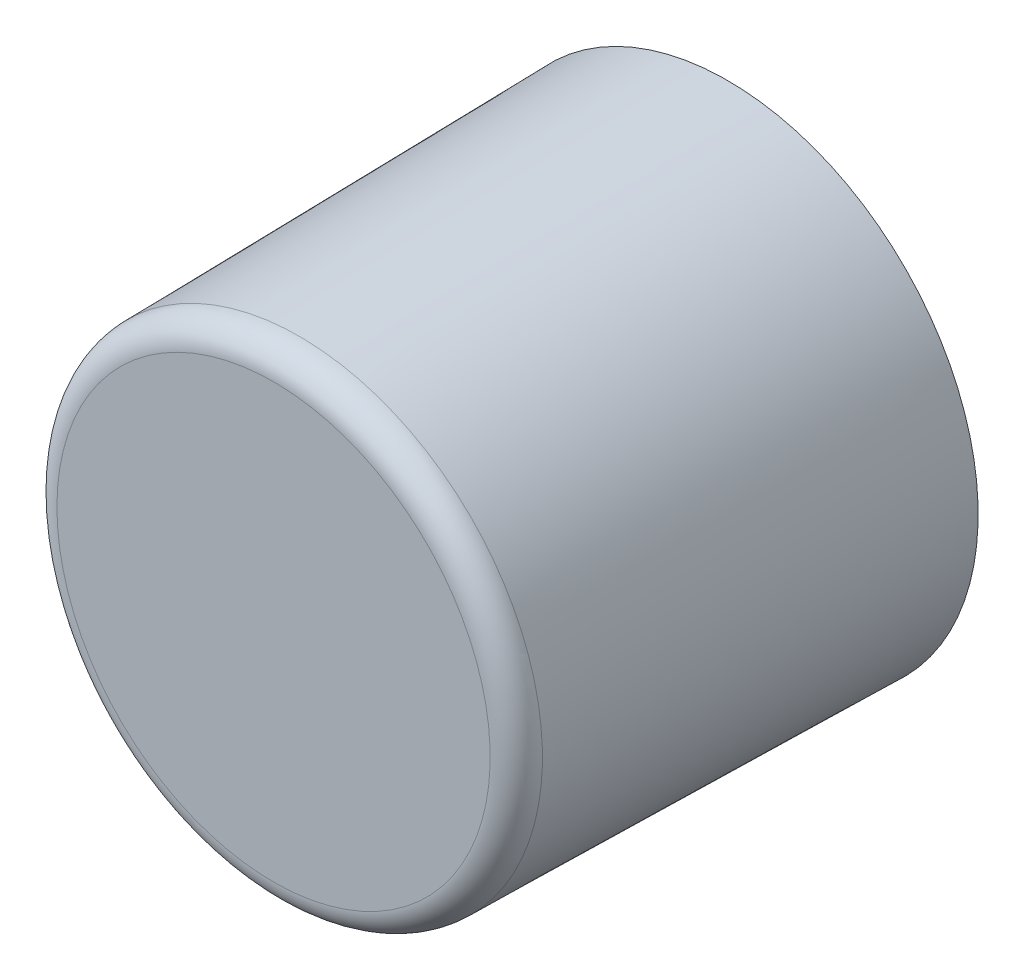
ISO-10303-21;
HEADER;
FILE_DESCRIPTION(('STEP AP214'),'2;1');
FILE_NAME('part.step','',(''),(''),'','','');
FILE_SCHEMA(('AUTOMOTIVE_DESIGN { 1 0 10303 214 1 1 1 1 }'));
ENDSEC;
DATA;
#1=APPLICATION_CONTEXT('core data for automotive mechanical design processes');
#2=APPLICATION_PROTOCOL_DEFINITION('international standard','automotive_design',2000,#1);
#3=PRODUCT_CONTEXT('',#1,'mechanical');
#4=PRODUCT('Part','Part','',(#3));
#5=PRODUCT_RELATED_PRODUCT_CATEGORY('part','',(#4));
#6=PRODUCT_DEFINITION_FORMATION('','',#4);
#7=PRODUCT_DEFINITION_CONTEXT('part definition',#1,'design');
#8=PRODUCT_DEFINITION('design','',#6,#7);
#9=PRODUCT_DEFINITION_SHAPE('','',#8);
#10=(LENGTH_UNIT() NAMED_UNIT(*) SI_UNIT(.MILLI.,.METRE.));
#11=(NAMED_UNIT(*) PLANE_ANGLE_UNIT() SI_UNIT($,.RADIAN.));
#12=(NAMED_UNIT(*) SI_UNIT($,.STERADIAN.) SOLID_ANGLE_UNIT());
#13=UNCERTAINTY_MEASURE_WITH_UNIT(LENGTH_MEASURE(1.E-05),#10,'distance_accuracy_value','');
#14=(GEOMETRIC_REPRESENTATION_CONTEXT(3) GLOBAL_UNCERTAINTY_ASSIGNED_CONTEXT((#13)) GLOBAL_UNIT_ASSIGNED_CONTEXT((#10,
#11,#12)) REPRESENTATION_CONTEXT('',''));
#15=CARTESIAN_POINT('',(0.,0.,0.));
#16=DIRECTION('',(0.,0.,1.));
#17=DIRECTION('',(1.,0.,0.));
#18=AXIS2_PLACEMENT_3D('',#15,#16,#17);
#19=CARTESIAN_POINT('',(0.,0.,-8.75));
#20=DIRECTION('',(0.,0.,1.));
#21=DIRECTION('',(1.,0.,0.));
#22=AXIS2_PLACEMENT_3D('',#19,#20,#21);
#23=PLANE('',#22);
#24=CARTESIAN_POINT('',(0.,0.,-8.75));
#25=DIRECTION('',(0.,0.,-1.));
#26=DIRECTION('',(-1.,0.,0.));
#27=AXIS2_PLACEMENT_3D('',#24,#25,#26);
#28=CIRCLE('',#27,4.826);
#29=CARTESIAN_POINT('',(-4.826,0.,-8.75));
#30=VERTEX_POINT('',#29);
#31=EDGE_CURVE('E80',#30,#30,#28,.T.);
#32=ORIENTED_EDGE('',*,*,#31,.T.);
#33=EDGE_LOOP('',(#32));
#34=FACE_BOUND('',#33,.T.);
#35=CARTESIAN_POINT('',(0.,0.,-8.75));
#36=DIRECTION('',(0.,0.,1.));
#37=DIRECTION('',(1.,0.,0.));
#38=AXIS2_PLACEMENT_3D('',#35,#36,#37);
#39=CIRCLE('',#38,3.125);
#40=CARTESIAN_POINT('',(3.125,0.,-8.75));
#41=VERTEX_POINT('',#40);
#42=EDGE_CURVE('E10',#41,#41,#39,.T.);
#43=ORIENTED_EDGE('',*,*,#42,.T.);
#44=EDGE_LOOP('',(#43));
#45=FACE_BOUND('',#44,.T.);
#46=ADVANCED_FACE('F15',(#34,#45),#23,.F.);
#47=CARTESIAN_POINT('',(0.,0.,-1.));
#48=DIRECTION('',(0.,0.,1.));
#49=DIRECTION('',(1.,0.,0.));
#50=AXIS2_PLACEMENT_3D('',#47,#48,#49);
#51=CYLINDRICAL_SURFACE('',#50,2.875);
#52=CARTESIAN_POINT('',(0.,0.,-8.5));
#53=DIRECTION('',(0.,0.,1.));
#54=DIRECTION('',(1.,0.,0.));
#55=AXIS2_PLACEMENT_3D('',#52,#53,#54);
#56=CIRCLE('',#55,2.875);
#57=CARTESIAN_POINT('',(2.875,0.,-8.5));
#58=VERTEX_POINT('',#57);
#59=EDGE_CURVE('E22',#58,#58,#56,.F.);
#60=ORIENTED_EDGE('',*,*,#59,.T.);
#61=EDGE_LOOP('',(#60));
#62=FACE_BOUND('',#61,.T.);
#63=CARTESIAN_POINT('',(0.,0.,-7.99855035159148));
#64=DIRECTION('',(0.,0.,1.));
#65=DIRECTION('',(1.,0.,0.));
#66=AXIS2_PLACEMENT_3D('',#63,#64,#65);
#67=CIRCLE('',#66,2.875);
#68=CARTESIAN_POINT('',(2.875,0.,-7.99855035159148));
#69=VERTEX_POINT('',#68);
#70=EDGE_CURVE('E59',#69,#69,#67,.T.);
#71=ORIENTED_EDGE('',*,*,#70,.T.);
#72=EDGE_LOOP('',(#71));
#73=FACE_BOUND('',#72,.T.);
#74=ADVANCED_FACE('F106',(#62,#73),#51,.F.);
#75=CARTESIAN_POINT('',(0.,0.,-5.73812986190585));
#76=DIRECTION('',(0.,0.,1.));
#77=DIRECTION('',(1.,0.,0.));
#78=AXIS2_PLACEMENT_3D('',#75,#76,#77);
#79=TOROIDAL_SURFACE('',#78,3.129,0.254);
#80=CARTESIAN_POINT('',(0.,0.,-5.73812986190585));
#81=DIRECTION('',(0.,0.,1.));
#82=DIRECTION('',(1.,0.,0.));
#83=AXIS2_PLACEMENT_3D('',#80,#81,#82);
#84=CIRCLE('',#83,2.875);
#85=CARTESIAN_POINT('',(2.875,0.,-5.73812986190585));
#86=VERTEX_POINT('',#85);
#87=EDGE_CURVE('E70',#86,#86,#84,.T.);
#88=ORIENTED_EDGE('',*,*,#87,.T.);
#89=EDGE_LOOP('',(#88));
#90=FACE_BOUND('',#89,.T.);
#91=CARTESIAN_POINT('',(0.,0.,-5.86512986190585));
#92=DIRECTION('',(0.,0.,1.));
#93=DIRECTION('',(1.,0.,0.));
#94=AXIS2_PLACEMENT_3D('',#91,#92,#93);
#95=CIRCLE('',#94,2.90902954743878);
#96=CARTESIAN_POINT('',(2.90902954743878,0.,-5.86512986190585));
#97=VERTEX_POINT('',#96);
#98=EDGE_CURVE('E30',#97,#97,#95,.T.);
#99=ORIENTED_EDGE('',*,*,#98,.F.);
#100=EDGE_LOOP('',(#99));
#101=FACE_BOUND('',#100,.T.);
#102=ADVANCED_FACE('F111',(#90,#101),#79,.T.);
#103=CARTESIAN_POINT('',(0.,0.,-6.10568021349746));
#104=DIRECTION('',(0.,0.,-1.));
#105=DIRECTION('',(-1.,0.,0.));
#106=AXIS2_PLACEMENT_3D('',#103,#104,#105);
#107=CONICAL_SURFACE('',#106,3.04791135768379,0.523598775598116);
#108=ORIENTED_EDGE('',*,*,#98,.T.);
#109=EDGE_LOOP('',(#108));
#110=FACE_BOUND('',#109,.T.);
#111=CARTESIAN_POINT('',(0.,0.,-6.10568021349746));
#112=DIRECTION('',(0.,0.,1.));
#113=DIRECTION('',(1.,0.,0.));
#114=AXIS2_PLACEMENT_3D('',#111,#112,#113);
#115=CIRCLE('',#114,3.04791135768379);
#116=CARTESIAN_POINT('',(3.04791135768379,0.,-6.10568021349746));
#117=VERTEX_POINT('',#116);
#118=EDGE_CURVE('E37',#117,#117,#115,.T.);
#119=ORIENTED_EDGE('',*,*,#118,.F.);
#120=EDGE_LOOP('',(#119));
#121=FACE_BOUND('',#120,.T.);
#122=ADVANCED_FACE('F117',(#110,#121),#107,.F.);
#123=CARTESIAN_POINT('',(0.,0.,-6.48668021349746));
#124=DIRECTION('',(0.,0.,1.));
#125=DIRECTION('',(1.,0.,0.));
#126=AXIS2_PLACEMENT_3D('',#123,#124,#125);
#127=TOROIDAL_SURFACE('',#126,2.38800000000005,0.762);
#128=ORIENTED_EDGE('',*,*,#118,.T.);
#129=EDGE_LOOP('',(#128));
#130=FACE_BOUND('',#129,.T.);
#131=CARTESIAN_POINT('',(0.,0.,-6.48668021349746));
#132=DIRECTION('',(0.,0.,1.));
#133=DIRECTION('',(1.,0.,0.));
#134=AXIS2_PLACEMENT_3D('',#131,#132,#133);
#135=CIRCLE('',#134,3.15000000000005);
#136=CARTESIAN_POINT('',(3.15000000000005,0.,-6.48668021349746));
#137=VERTEX_POINT('',#136);
#138=EDGE_CURVE('E43',#137,#137,#135,.T.);
#139=ORIENTED_EDGE('',*,*,#138,.F.);
#140=EDGE_LOOP('',(#139));
#141=FACE_BOUND('',#140,.T.);
#142=ADVANCED_FACE('F139',(#130,#141),#127,.F.);
#143=CARTESIAN_POINT('',(0.,0.,-1.));
#144=DIRECTION('',(0.,0.,1.));
#145=DIRECTION('',(1.,0.,0.));
#146=AXIS2_PLACEMENT_3D('',#143,#144,#145);
#147=CYLINDRICAL_SURFACE('',#146,3.15000000000007);
#148=ORIENTED_EDGE('',*,*,#138,.T.);
#149=EDGE_LOOP('',(#148));
#150=FACE_BOUND('',#149,.T.);
#151=CARTESIAN_POINT('',(0.,0.,-7.24999999999988));
#152=DIRECTION('',(0.,0.,1.));
#153=DIRECTION('',(1.,0.,0.));
#154=AXIS2_PLACEMENT_3D('',#151,#152,#153);
#155=CIRCLE('',#154,3.15000000000008);
#156=CARTESIAN_POINT('',(3.15000000000008,0.,-7.24999999999988));
#157=VERTEX_POINT('',#156);
#158=EDGE_CURVE('E47',#157,#157,#155,.T.);
#159=ORIENTED_EDGE('',*,*,#158,.F.);
#160=EDGE_LOOP('',(#159));
#161=FACE_BOUND('',#160,.T.);
#162=ADVANCED_FACE('F135',(#150,#161),#147,.F.);
#163=CARTESIAN_POINT('',(0.,0.,-7.24999999999988));
#164=DIRECTION('',(0.,0.,1.));
#165=DIRECTION('',(1.,0.,0.));
#166=AXIS2_PLACEMENT_3D('',#163,#164,#165);
#167=TOROIDAL_SURFACE('',#166,2.38800000000009,0.761999999999989);
#168=ORIENTED_EDGE('',*,*,#158,.T.);
#169=EDGE_LOOP('',(#168));
#170=FACE_BOUND('',#169,.T.);
#171=CARTESIAN_POINT('',(0.,0.,-7.63099999999988));
#172=DIRECTION('',(0.,0.,1.));
#173=DIRECTION('',(1.,0.,0.));
#174=AXIS2_PLACEMENT_3D('',#171,#172,#173);
#175=CIRCLE('',#174,3.04791135768382);
#176=CARTESIAN_POINT('',(3.04791135768382,0.,-7.63099999999988));
#177=VERTEX_POINT('',#176);
#178=EDGE_CURVE('E51',#177,#177,#175,.T.);
#179=ORIENTED_EDGE('',*,*,#178,.F.);
#180=EDGE_LOOP('',(#179));
#181=FACE_BOUND('',#180,.T.);
#182=ADVANCED_FACE('F131',(#170,#181),#167,.F.);
#183=CARTESIAN_POINT('',(0.,0.,-7.87155035159148));
#184=DIRECTION('',(0.,0.,1.));
#185=DIRECTION('',(1.,0.,0.));
#186=AXIS2_PLACEMENT_3D('',#183,#184,#185);
#187=CONICAL_SURFACE('',#186,2.90902954743876,0.52359877559829);
#188=ORIENTED_EDGE('',*,*,#178,.T.);
#189=EDGE_LOOP('',(#188));
#190=FACE_BOUND('',#189,.T.);
#191=CARTESIAN_POINT('',(0.,0.,-7.87155035159148));
#192=DIRECTION('',(0.,0.,1.));
#193=DIRECTION('',(1.,0.,0.));
#194=AXIS2_PLACEMENT_3D('',#191,#192,#193);
#195=CIRCLE('',#194,2.90902954743876);
#196=CARTESIAN_POINT('',(2.90902954743876,0.,-7.87155035159148));
#197=VERTEX_POINT('',#196);
#198=EDGE_CURVE('E55',#197,#197,#195,.T.);
#199=ORIENTED_EDGE('',*,*,#198,.F.);
#200=EDGE_LOOP('',(#199));
#201=FACE_BOUND('',#200,.T.);
#202=ADVANCED_FACE('F127',(#190,#201),#187,.F.);
#203=CARTESIAN_POINT('',(0.,0.,-7.99855035159155));
#204=DIRECTION('',(0.,0.,1.));
#205=DIRECTION('',(1.,0.,0.));
#206=AXIS2_PLACEMENT_3D('',#203,#204,#205);
#207=TOROIDAL_SURFACE('',#206,3.129,0.254000000000006);
#208=ORIENTED_EDGE('',*,*,#198,.T.);
#209=EDGE_LOOP('',(#208));
#210=FACE_BOUND('',#209,.T.);
#211=ORIENTED_EDGE('',*,*,#70,.F.);
#212=EDGE_LOOP('',(#211));
#213=FACE_BOUND('',#212,.T.);
#214=ADVANCED_FACE('F124',(#210,#213),#207,.T.);
#215=CARTESIAN_POINT('',(-2.375,0.,-1.));
#216=DIRECTION('',(0.,0.,-1.));
#217=DIRECTION('',(-1.,0.,0.));
#218=AXIS2_PLACEMENT_3D('',#215,#216,#217);
#219=PLANE('',#218);
#220=CARTESIAN_POINT('',(0.,0.,-1.));
#221=DIRECTION('',(0.,0.,1.));
#222=DIRECTION('',(1.,0.,0.));
#223=AXIS2_PLACEMENT_3D('',#220,#221,#222);
#224=CIRCLE('',#223,2.375);
#225=CARTESIAN_POINT('',(2.375,0.,-1.));
#226=VERTEX_POINT('',#225);
#227=EDGE_CURVE('E62',#226,#226,#224,.T.);
#228=ORIENTED_EDGE('',*,*,#227,.F.);
#229=EDGE_LOOP('',(#228));
#230=FACE_BOUND('',#229,.T.);
#231=ADVANCED_FACE('F122',(#230),#219,.T.);
#232=CARTESIAN_POINT('',(0.,0.,-1.5));
#233=DIRECTION('',(0.,0.,1.));
#234=DIRECTION('',(1.,0.,0.));
#235=AXIS2_PLACEMENT_3D('',#232,#233,#234);
#236=TOROIDAL_SURFACE('',#235,2.375,0.5);
#237=ORIENTED_EDGE('',*,*,#227,.T.);
#238=EDGE_LOOP('',(#237));
#239=FACE_BOUND('',#238,.T.);
#240=CARTESIAN_POINT('',(0.,0.,-1.5));
#241=DIRECTION('',(0.,0.,1.));
#242=DIRECTION('',(1.,0.,0.));
#243=AXIS2_PLACEMENT_3D('',#240,#241,#242);
#244=CIRCLE('',#243,2.875);
#245=CARTESIAN_POINT('',(2.875,0.,-1.5));
#246=VERTEX_POINT('',#245);
#247=EDGE_CURVE('E66',#246,#246,#244,.T.);
#248=ORIENTED_EDGE('',*,*,#247,.F.);
#249=EDGE_LOOP('',(#248));
#250=FACE_BOUND('',#249,.T.);
#251=ADVANCED_FACE('F201',(#239,#250),#236,.F.);
#252=CARTESIAN_POINT('',(0.,0.,-1.));
#253=DIRECTION('',(0.,0.,1.));
#254=DIRECTION('',(1.,0.,0.));
#255=AXIS2_PLACEMENT_3D('',#252,#253,#254);
#256=CYLINDRICAL_SURFACE('',#255,2.875);
#257=ORIENTED_EDGE('',*,*,#247,.T.);
#258=EDGE_LOOP('',(#257));
#259=FACE_BOUND('',#258,.T.);
#260=ORIENTED_EDGE('',*,*,#87,.F.);
#261=EDGE_LOOP('',(#260));
#262=FACE_BOUND('',#261,.T.);
#263=ADVANCED_FACE('F209',(#259,#262),#256,.F.);
#264=CARTESIAN_POINT('',(0.,0.,-8.5));
#265=DIRECTION('',(0.,0.,1.));
#266=DIRECTION('',(1.,0.,0.));
#267=AXIS2_PLACEMENT_3D('',#264,#265,#266);
#268=TOROIDAL_SURFACE('',#267,3.125,0.25);
#269=ORIENTED_EDGE('',*,*,#42,.F.);
#270=EDGE_LOOP('',(#269));
#271=FACE_BOUND('',#270,.T.);
#272=ORIENTED_EDGE('',*,*,#59,.F.);
#273=EDGE_LOOP('',(#272));
#274=FACE_BOUND('',#273,.T.);
#275=ADVANCED_FACE('F95',(#271,#274),#268,.T.);
#276=CARTESIAN_POINT('',(0.,0.,-0.508));
#277=DIRECTION('',(0.,0.,-1.));
#278=DIRECTION('',(-1.,0.,0.));
#279=AXIS2_PLACEMENT_3D('',#276,#277,#278);
#280=TOROIDAL_SURFACE('',#279,4.17405797221532,0.508);
#281=CARTESIAN_POINT('',(0.,0.,-0.499134177529864));
#282=DIRECTION('',(0.,0.,-1.));
#283=DIRECTION('',(-1.,0.,0.));
#284=AXIS2_PLACEMENT_3D('',#281,#282,#283);
#285=CIRCLE('',#284,4.68198060135477);
#286=CARTESIAN_POINT('',(-4.68198060135477,0.,-0.499134177529864));
#287=VERTEX_POINT('',#286);
#288=EDGE_CURVE('E77',#287,#287,#285,.T.);
#289=ORIENTED_EDGE('',*,*,#288,.F.);
#290=EDGE_LOOP('',(#289));
#291=FACE_BOUND('',#290,.T.);
#292=CARTESIAN_POINT('',(0.,0.,0.));
#293=DIRECTION('',(0.,0.,-1.));
#294=DIRECTION('',(-1.,0.,0.));
#295=AXIS2_PLACEMENT_3D('',#292,#293,#294);
#296=CIRCLE('',#295,4.17405797221532);
#297=CARTESIAN_POINT('',(-4.17405797221532,0.,0.));
#298=VERTEX_POINT('',#297);
#299=EDGE_CURVE('E74',#298,#298,#296,.T.);
#300=ORIENTED_EDGE('',*,*,#299,.T.);
#301=EDGE_LOOP('',(#300));
#302=FACE_BOUND('',#301,.T.);
#303=ADVANCED_FACE('F89',(#291,#302),#280,.T.);
#304=CARTESIAN_POINT('',(0.,0.,-0.499134177529864));
#305=DIRECTION('',(0.,0.,-1.));
#306=DIRECTION('',(-1.,0.,0.));
#307=AXIS2_PLACEMENT_3D('',#304,#305,#306);
#308=CONICAL_SURFACE('',#307,4.68198060135477,0.0174532925199432);
#309=ORIENTED_EDGE('',*,*,#31,.F.);
#310=EDGE_LOOP('',(#309));
#311=FACE_BOUND('',#310,.T.);
#312=ORIENTED_EDGE('',*,*,#288,.T.);
#313=EDGE_LOOP('',(#312));
#314=FACE_BOUND('',#313,.T.);
#315=ADVANCED_FACE('F85',(#311,#314),#308,.T.);
#316=CARTESIAN_POINT('',(0.,0.,0.));
#317=DIRECTION('',(0.,0.,1.));
#318=DIRECTION('',(1.,0.,0.));
#319=AXIS2_PLACEMENT_3D('',#316,#317,#318);
#320=PLANE('',#319);
#321=ORIENTED_EDGE('',*,*,#299,.F.);
#322=EDGE_LOOP('',(#321));
#323=FACE_BOUND('',#322,.T.);
#324=ADVANCED_FACE('F88',(#323),#320,.T.);
#325=CLOSED_SHELL('',(#46,#74,#102,#122,#142,#162,#182,#202,#214,#231,#251,#263,#275,#303,#315,#324));
#326=MANIFOLD_SOLID_BREP('B1',#325);
#327=ADVANCED_BREP_SHAPE_REPRESENTATION('',(#18,#326),#14);
#328=SHAPE_DEFINITION_REPRESENTATION(#9,#327);
ENDSEC;
END-ISO-10303-21;
